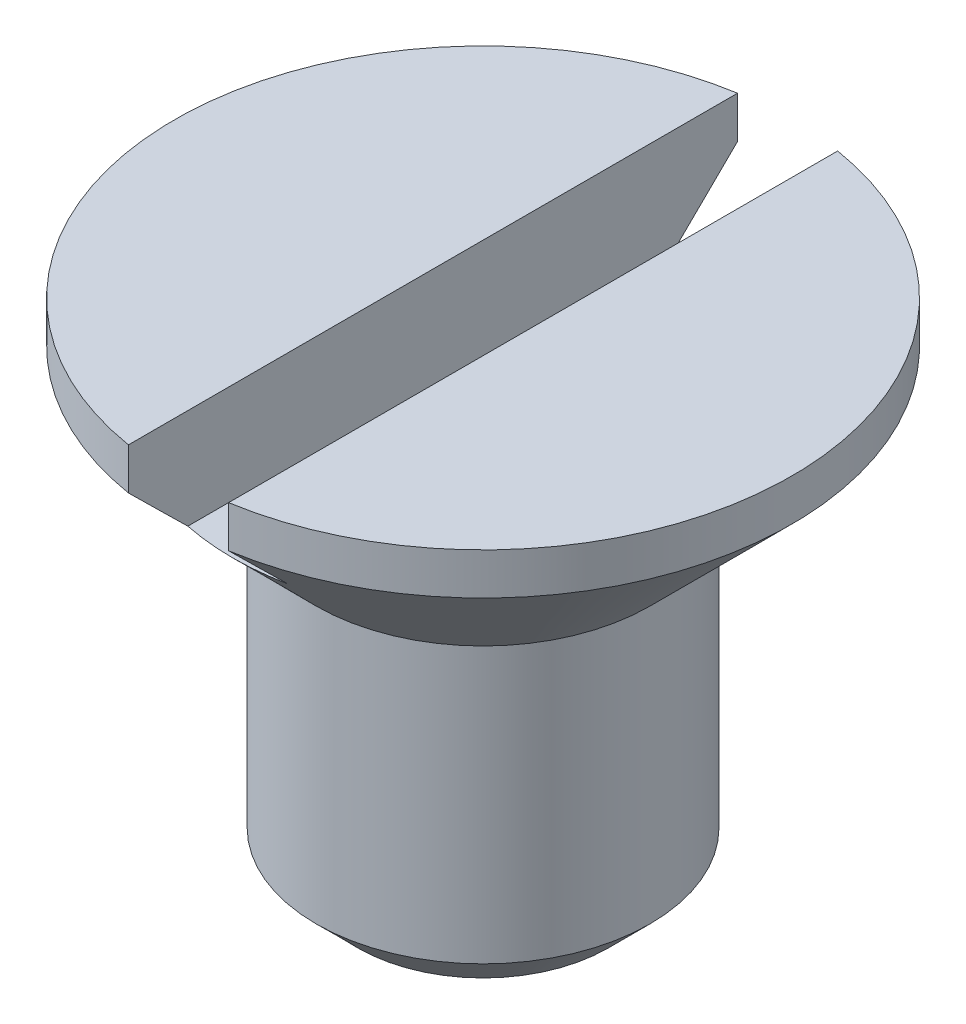
ISO-10303-21;
HEADER;
FILE_DESCRIPTION(('STEP AP214'),'2;1');
FILE_NAME('part.step','',(''),(''),'','','');
FILE_SCHEMA(('AUTOMOTIVE_DESIGN { 1 0 10303 214 1 1 1 1 }'));
ENDSEC;
DATA;
#1=APPLICATION_CONTEXT('core data for automotive mechanical design processes');
#2=APPLICATION_PROTOCOL_DEFINITION('international standard','automotive_design',2000,#1);
#3=PRODUCT_CONTEXT('',#1,'mechanical');
#4=PRODUCT('Part','Part','',(#3));
#5=PRODUCT_RELATED_PRODUCT_CATEGORY('part','',(#4));
#6=PRODUCT_DEFINITION_FORMATION('','',#4);
#7=PRODUCT_DEFINITION_CONTEXT('part definition',#1,'design');
#8=PRODUCT_DEFINITION('design','',#6,#7);
#9=PRODUCT_DEFINITION_SHAPE('','',#8);
#10=(LENGTH_UNIT() NAMED_UNIT(*) SI_UNIT(.MILLI.,.METRE.));
#11=(NAMED_UNIT(*) PLANE_ANGLE_UNIT() SI_UNIT($,.RADIAN.));
#12=(NAMED_UNIT(*) SI_UNIT($,.STERADIAN.) SOLID_ANGLE_UNIT());
#13=UNCERTAINTY_MEASURE_WITH_UNIT(LENGTH_MEASURE(1.E-05),#10,'distance_accuracy_value','');
#14=(GEOMETRIC_REPRESENTATION_CONTEXT(3) GLOBAL_UNCERTAINTY_ASSIGNED_CONTEXT((#13)) GLOBAL_UNIT_ASSIGNED_CONTEXT((#10,
#11,#12)) REPRESENTATION_CONTEXT('',''));
#15=CARTESIAN_POINT('',(0.,0.,0.));
#16=DIRECTION('',(0.,0.,1.));
#17=DIRECTION('',(1.,0.,0.));
#18=AXIS2_PLACEMENT_3D('',#15,#16,#17);
#19=CARTESIAN_POINT('',(-3.7,6.,0.));
#20=DIRECTION('',(0.,1.,0.));
#21=DIRECTION('',(-1.,0.,0.));
#22=AXIS2_PLACEMENT_3D('',#19,#20,#21);
#23=PLANE('',#22);
#24=DIRECTION('',(0.,0.,1.));
#25=VECTOR('',#24,1.);
#26=CARTESIAN_POINT('',(-0.6,6.,-3.7));
#27=LINE('',#26,#25);
#28=CARTESIAN_POINT('',(-0.6,6.,-3.65102725270574));
#29=VERTEX_POINT('',#28);
#30=CARTESIAN_POINT('',(-0.6,6.,3.65102725270574));
#31=VERTEX_POINT('',#30);
#32=EDGE_CURVE('E136',#29,#31,#27,.T.);
#33=ORIENTED_EDGE('',*,*,#32,.F.);
#34=CARTESIAN_POINT('',(0.,6.,0.));
#35=DIRECTION('',(0.,1.,0.));
#36=DIRECTION('',(-1.,0.,0.));
#37=AXIS2_PLACEMENT_3D('',#34,#35,#36);
#38=CIRCLE('',#37,3.7);
#39=EDGE_CURVE('E113',#29,#31,#38,.T.);
#40=ORIENTED_EDGE('',*,*,#39,.T.);
#41=EDGE_LOOP('',(#33,#40));
#42=FACE_BOUND('',#41,.T.);
#43=ADVANCED_FACE('F29',(#42),#23,.T.);
#44=CARTESIAN_POINT('',(0.,6.,0.));
#45=DIRECTION('',(0.,1.,0.));
#46=DIRECTION('',(-1.,0.,0.));
#47=AXIS2_PLACEMENT_3D('',#44,#45,#46);
#48=CYLINDRICAL_SURFACE('',#47,3.7);
#49=DIRECTION('',(0.,1.,0.));
#50=VECTOR('',#49,1.);
#51=CARTESIAN_POINT('',(-0.6,6.,3.65102725270574));
#52=LINE('',#51,#50);
#53=CARTESIAN_POINT('',(-0.6,5.50000000000002,3.65102725270574));
#54=VERTEX_POINT('',#53);
#55=EDGE_CURVE('E57',#31,#54,#52,.F.);
#56=ORIENTED_EDGE('',*,*,#55,.F.);
#57=ORIENTED_EDGE('',*,*,#39,.F.);
#58=DIRECTION('',(0.,1.,0.));
#59=VECTOR('',#58,1.);
#60=CARTESIAN_POINT('',(-0.6,6.,-3.65102725270574));
#61=LINE('',#60,#59);
#62=CARTESIAN_POINT('',(-0.6,5.50000000000002,-3.65102725270574));
#63=VERTEX_POINT('',#62);
#64=EDGE_CURVE('E130',#63,#29,#61,.T.);
#65=ORIENTED_EDGE('',*,*,#64,.F.);
#66=CARTESIAN_POINT('',(0.,5.50000000000002,0.));
#67=DIRECTION('',(0.,1.,0.));
#68=DIRECTION('',(-1.,0.,0.));
#69=AXIS2_PLACEMENT_3D('',#66,#67,#68);
#70=CIRCLE('',#69,3.7);
#71=EDGE_CURVE('E117',#63,#54,#70,.T.);
#72=ORIENTED_EDGE('',*,*,#71,.T.);
#73=EDGE_LOOP('',(#56,#57,#65,#72));
#74=FACE_BOUND('',#73,.T.);
#75=ADVANCED_FACE('F146',(#74),#48,.T.);
#76=DIRECTION('',(0.,0.,1.));
#77=VECTOR('',#76,1.);
#78=CARTESIAN_POINT('',(0.6,6.,-3.7));
#79=LINE('',#78,#77);
#80=CARTESIAN_POINT('',(0.6,6.,-3.65102725270574));
#81=VERTEX_POINT('',#80);
#82=CARTESIAN_POINT('',(0.6,6.,3.65102725270574));
#83=VERTEX_POINT('',#82);
#84=EDGE_CURVE('E100',#81,#83,#79,.T.);
#85=ORIENTED_EDGE('',*,*,#84,.T.);
#86=EDGE_CURVE('E111',#83,#81,#38,.T.);
#87=ORIENTED_EDGE('',*,*,#86,.T.);
#88=EDGE_LOOP('',(#85,#87));
#89=FACE_BOUND('',#88,.T.);
#90=ADVANCED_FACE('F31',(#89),#23,.T.);
#91=DIRECTION('',(0.,1.,0.));
#92=VECTOR('',#91,1.);
#93=CARTESIAN_POINT('',(0.6,6.,-3.65102725270574));
#94=LINE('',#93,#92);
#95=CARTESIAN_POINT('',(0.6,5.50000000000002,-3.65102725270574));
#96=VERTEX_POINT('',#95);
#97=EDGE_CURVE('E132',#81,#96,#94,.F.);
#98=ORIENTED_EDGE('',*,*,#97,.F.);
#99=ORIENTED_EDGE('',*,*,#86,.F.);
#100=DIRECTION('',(0.,1.,0.));
#101=VECTOR('',#100,1.);
#102=CARTESIAN_POINT('',(0.6,6.,3.65102725270574));
#103=LINE('',#102,#101);
#104=CARTESIAN_POINT('',(0.6,5.50000000000002,3.65102725270574));
#105=VERTEX_POINT('',#104);
#106=EDGE_CURVE('E134',#105,#83,#103,.T.);
#107=ORIENTED_EDGE('',*,*,#106,.F.);
#108=EDGE_CURVE('E106',#105,#96,#70,.T.);
#109=ORIENTED_EDGE('',*,*,#108,.T.);
#110=EDGE_LOOP('',(#98,#99,#107,#109));
#111=FACE_BOUND('',#110,.T.);
#112=ADVANCED_FACE('F153',(#111),#48,.T.);
#113=CARTESIAN_POINT('',(0.,5.50000000000002,0.));
#114=DIRECTION('',(0.,1.,0.));
#115=DIRECTION('',(-1.,0.,0.));
#116=AXIS2_PLACEMENT_3D('',#113,#114,#115);
#117=CONICAL_SURFACE('',#116,3.7,0.785398163397443);
#118=CARTESIAN_POINT('',(-0.600000000000001,9.96002062419557,8.13793196010486));
#119=CARTESIAN_POINT('',(-0.600000000000001,9.67689128128451,7.85402777231897));
#120=CARTESIAN_POINT('',(-0.600000000000001,9.39379608619092,7.57008950002177));
#121=CARTESIAN_POINT('',(-0.600000000000001,8.82770997014745,7.00209082271698));
#122=CARTESIAN_POINT('',(-0.600000000000001,8.54471905284609,6.71803041407336));
#123=CARTESIAN_POINT('',(-0.6,7.97868260725446,6.14953775036886));
#124=CARTESIAN_POINT('',(-0.6,7.69563719837716,5.86510537638401));
#125=CARTESIAN_POINT('',(-0.6,7.12979934399216,5.29600682483286));
#126=CARTESIAN_POINT('',(-0.6,6.84700689083492,5.01134065487301));
#127=CARTESIAN_POINT('',(-0.6,6.28573332583054,4.44556875001047));
#128=CARTESIAN_POINT('',(-0.6,6.00724680806451,4.16446838236597));
#129=CARTESIAN_POINT('',(-0.6,5.59002402076898,3.74228982182657));
#130=CARTESIAN_POINT('',(-0.6,5.45102756858926,3.60146883259403));
#131=CARTESIAN_POINT('',(-0.6,5.17328458074779,3.31958319518965));
#132=CARTESIAN_POINT('',(-0.6,5.0345380427178,3.17851854935183));
#133=CARTESIAN_POINT('',(-0.6,4.7574716483417,2.89609946410978));
#134=CARTESIAN_POINT('',(-0.6,4.6191516232573,2.75474519043096));
#135=CARTESIAN_POINT('',(-0.6,4.34307152650493,2.47148070482769));
#136=CARTESIAN_POINT('',(-0.6,4.20531147549013,2.32957047277055));
#137=CARTESIAN_POINT('',(-0.6,3.93074167412053,2.04487556787213));
#138=CARTESIAN_POINT('',(-0.6,3.79393176803235,1.90209104591261));
#139=CARTESIAN_POINT('',(-0.6,3.59005283805898,1.68665676476746));
#140=CARTESIAN_POINT('',(-0.6,3.52231783944741,1.61463791010643));
#141=CARTESIAN_POINT('',(-0.6,3.38750438125967,1.4699889932015));
#142=CARTESIAN_POINT('',(-0.599999999999999,3.3204259074044,1.39735894431496));
#143=CARTESIAN_POINT('',(-0.599999999999999,3.21737067452687,1.28421539613836));
#144=CARTESIAN_POINT('',(-0.599999999999999,3.18104052020517,1.2440240295227));
#145=CARTESIAN_POINT('',(-0.599999999999999,3.10877701321241,1.16328117926467));
#146=CARTESIAN_POINT('',(-0.599999999999999,3.07284368408855,1.12272967450692));
#147=CARTESIAN_POINT('',(-0.599999999999999,3.0013920679676,1.04102691374381));
#148=CARTESIAN_POINT('',(-0.599999999999999,2.96587552547039,0.999874128580939));
#149=CARTESIAN_POINT('',(-0.599999999999999,2.89558487643354,0.916946976871492));
#150=CARTESIAN_POINT('',(-0.599999999999999,2.86081066138162,0.875172702709307));
#151=CARTESIAN_POINT('',(-0.599999999999999,2.79510737046944,0.794199307952507));
#152=CARTESIAN_POINT('',(-0.599999999999999,2.76409575648193,0.755067466057446));
#153=CARTESIAN_POINT('',(-0.599999999999999,2.70336797523996,0.675813657835006));
#154=CARTESIAN_POINT('',(-0.599999999999999,2.67365157281672,0.635691873338646));
#155=CARTESIAN_POINT('',(-0.599999999999999,2.61622665647741,0.554135181970048));
#156=CARTESIAN_POINT('',(-0.599999999999999,2.58851442849082,0.512702919788465));
#157=CARTESIAN_POINT('',(-0.599999999999999,2.53621522205618,0.427935425074668));
#158=CARTESIAN_POINT('',(-0.599999999999999,2.51162392023787,0.384602939456317));
#159=CARTESIAN_POINT('',(-0.599999999999999,2.47077124344621,0.301726491885899));
#160=CARTESIAN_POINT('',(-0.599999999999999,2.45382070718996,0.262532602955205));
#161=CARTESIAN_POINT('',(-0.599999999999999,2.42590828603838,0.18210931201581));
#162=CARTESIAN_POINT('',(-0.599999999999999,2.41492295078954,0.140888585704837));
#163=CARTESIAN_POINT('',(-0.599999999999999,2.402410068702,0.0639247858075754));
#164=CARTESIAN_POINT('',(-0.599999999999999,2.39962349148702,0.0283967599025259));
#165=CARTESIAN_POINT('',(-0.599999999999999,2.40046012470945,-0.0425631065150499));
#166=CARTESIAN_POINT('',(-0.599999999999999,2.40408119868653,-0.0779949751437847));
#167=CARTESIAN_POINT('',(-0.599999999999999,2.4191108613007,-0.159349986954467));
#168=CARTESIAN_POINT('',(-0.599999999999999,2.43270391393231,-0.204855293705316));
#169=CARTESIAN_POINT('',(-0.599999999999999,2.4581067891676,-0.271162915462737));
#170=CARTESIAN_POINT('',(-0.599999999999999,2.46744883758507,-0.293008638455446));
#171=CARTESIAN_POINT('',(-0.599999999999999,2.48745397120612,-0.336087239478989));
#172=CARTESIAN_POINT('',(-0.599999999999999,2.49811672299073,-0.357320270525167));
#173=CARTESIAN_POINT('',(-0.599999999999999,2.52939555581038,-0.415982831640744));
#174=CARTESIAN_POINT('',(-0.599999999999999,2.55115624380447,-0.452795694277321));
#175=CARTESIAN_POINT('',(-0.599999999999999,2.59682208128607,-0.52507796498419));
#176=CARTESIAN_POINT('',(-0.599999999999999,2.62072901479265,-0.560546219893633));
#177=CARTESIAN_POINT('',(-0.599999999999999,2.67004195715455,-0.630548437000623));
#178=CARTESIAN_POINT('',(-0.599999999999999,2.69545152537907,-0.665079873092611));
#179=CARTESIAN_POINT('',(-0.599999999999999,2.74728510442057,-0.733375806005284));
#180=CARTESIAN_POINT('',(-0.599999999999999,2.77370928127677,-0.767140175845293));
#181=CARTESIAN_POINT('',(-0.599999999999999,2.85434134965784,-0.867919244140601));
#182=CARTESIAN_POINT('',(-0.599999999999999,2.90964257975872,-0.934056109051688));
#183=CARTESIAN_POINT('',(-0.599999999999999,3.02176654130163,-1.06481071116445));
#184=CARTESIAN_POINT('',(-0.599999999999999,3.07858650349832,-1.12943085704489));
#185=CARTESIAN_POINT('',(-0.599999999999999,3.192411871062,-1.25682824367007));
#186=CARTESIAN_POINT('',(-0.6,3.24940259970986,-1.31961861941938));
#187=CARTESIAN_POINT('',(-0.6,3.36404478846879,-1.44459287058124));
#188=CARTESIAN_POINT('',(-0.6,3.42169625897606,-1.5067767364223));
#189=CARTESIAN_POINT('',(-0.6,3.59534223900288,-1.69270278432736));
#190=CARTESIAN_POINT('',(-0.6,3.71201793375948,-1.81580796723871));
#191=CARTESIAN_POINT('',(-0.6,3.9464428075933,-2.06118874847644));
#192=CARTESIAN_POINT('',(-0.6,4.06419282008441,-2.18346354647027));
#193=CARTESIAN_POINT('',(-0.6,4.30028890308817,-2.42742423040912));
#194=CARTESIAN_POINT('',(-0.6,4.41863494334996,-2.54911014563974));
#195=CARTESIAN_POINT('',(-0.6,4.65500717812542,-2.79137280615532));
#196=CARTESIAN_POINT('',(-0.6,4.77303104136329,-2.91195182898467));
#197=CARTESIAN_POINT('',(-0.6,5.00934781550327,-3.15284893689332));
#198=CARTESIAN_POINT('',(-0.6,5.12764072989205,-3.2731670185511));
#199=CARTESIAN_POINT('',(-0.6,5.48272713697438,-3.63376526150939));
#200=CARTESIAN_POINT('',(-0.6,5.71980374699246,-3.87376652863284));
#201=CARTESIAN_POINT('',(-0.6,6.28863195924062,-4.44861133790154));
#202=CARTESIAN_POINT('',(-0.6,6.62058203399434,-4.78325830289937));
#203=CARTESIAN_POINT('',(-0.6,7.28494781383586,-5.45216769917103));
#204=CARTESIAN_POINT('',(-0.6,7.61736356911089,-5.78643008057183));
#205=CARTESIAN_POINT('',(-0.6,8.28474579300058,-6.45701285565824));
#206=CARTESIAN_POINT('',(-0.6,8.61971401228284,-6.79333150662997));
#207=CARTESIAN_POINT('',(-0.600000000000001,9.28978081055595,-7.46575829971186));
#208=CARTESIAN_POINT('',(-0.600000000000001,9.62487936901474,-7.80186646228029));
#209=CARTESIAN_POINT('',(-0.600000000000001,9.96002062419557,-8.13793196010486));
#210=B_SPLINE_CURVE_WITH_KNOTS('',3,(#118,#119,#120,#121,#122,#123,#124,#125,#126,#127,#128,
#129,#130,#131,#132,#133,#134,#135,#136,#137,#138,#139,#140,#141,#142,#143,#144,#145,#146,#147,
#148,#149,#150,#151,#152,#153,#154,#155,#156,#157,#158,#159,#160,#161,#162,#163,#164,#165,#166,
#167,#168,#169,#170,#171,#172,#173,#174,#175,#176,#177,#178,#179,#180,#181,#182,#183,#184,#185,
#186,#187,#188,#189,#190,#191,#192,#193,#194,#195,#196,#197,#198,#199,#200,#201,#202,#203,#204,
#205,#206,#207,#208,#209),.UNSPECIFIED.,.F.,.F.,(4,2,2,2,2,2,2,2,2,2,2,2,2,2,2,2,2,2,2,2,2,2,2,
2,2,2,2,2,2,2,2,2,2,2,2,2,2,2,2,2,2,2,2,2,2,4),(0.,1.20286091475452,2.40576053584867,
3.6095661884296,4.81333411531858,6.00040930817249,6.59400413473686,7.18759330634946,
7.78090579697013,8.3742399753186,8.96747449255334,9.26407415171825,9.56066734558071,
9.72319861560583,9.8857394788069,10.0488126207255,10.2118617593269,10.3616347814149,
10.5113804952798,10.6608411897886,10.8100925247216,10.9379019301194,11.0652051861339,
11.1715563779878,11.2778721165554,11.4194479223042,11.490703624151,11.5619413736212,
11.6901080531411,11.8183822726337,11.9469735623142,12.075585986218,12.3341618029343,
12.5922945826552,12.8466786122314,13.1010666498339,13.6098890890933,14.1191470825748,
14.6283794844878,15.1345611743107,15.6407494616196,16.6528023877672,18.066879145093,
19.4811222704146,20.9051395740234,22.3289855542461),.UNSPECIFIED.);
#211=CARTESIAN_POINT('',(-0.6,4.8,2.9393876913398));
#212=VERTEX_POINT('',#211);
#213=EDGE_CURVE('E11',#54,#212,#210,.T.);
#214=ORIENTED_EDGE('',*,*,#213,.F.);
#215=ORIENTED_EDGE('',*,*,#71,.F.);
#216=CARTESIAN_POINT('',(-0.6,4.8,-2.9393876913398));
#217=VERTEX_POINT('',#216);
#218=EDGE_CURVE('E33',#217,#63,#210,.T.);
#219=ORIENTED_EDGE('',*,*,#218,.F.);
#220=CARTESIAN_POINT('',(0.,4.8,0.));
#221=DIRECTION('',(0.,-1.,0.));
#222=DIRECTION('',(0.,0.,-1.));
#223=AXIS2_PLACEMENT_3D('',#220,#221,#222);
#224=CIRCLE('',#223,2.99999999999999);
#225=CARTESIAN_POINT('',(0.6,4.8,-2.9393876913398));
#226=VERTEX_POINT('',#225);
#227=EDGE_CURVE('E93',#226,#217,#224,.F.);
#228=ORIENTED_EDGE('',*,*,#227,.F.);
#229=CARTESIAN_POINT('',(0.600000000000001,9.96002062419557,-8.13793196010486));
#230=CARTESIAN_POINT('',(0.600000000000001,9.67689128128451,-7.85402777231897));
#231=CARTESIAN_POINT('',(0.600000000000001,9.39379608619092,-7.57008950002176));
#232=CARTESIAN_POINT('',(0.600000000000001,8.82770997014745,-7.00209082271698));
#233=CARTESIAN_POINT('',(0.600000000000001,8.54471905284609,-6.71803041407335));
#234=CARTESIAN_POINT('',(0.6,7.97868260725446,-6.14953775036886));
#235=CARTESIAN_POINT('',(0.6,7.69563719837715,-5.865105376384));
#236=CARTESIAN_POINT('',(0.6,7.12979934399215,-5.29600682483285));
#237=CARTESIAN_POINT('',(0.6,6.84700689083491,-5.011340654873));
#238=CARTESIAN_POINT('',(0.6,6.28573332583054,-4.44556875001047));
#239=CARTESIAN_POINT('',(0.6,6.0072468080645,-4.16446838236596));
#240=CARTESIAN_POINT('',(0.6,5.59002402076897,-3.74228982182656));
#241=CARTESIAN_POINT('',(0.6,5.45102756858925,-3.60146883259402));
#242=CARTESIAN_POINT('',(0.6,5.17328458074778,-3.31958319518964));
#243=CARTESIAN_POINT('',(0.6,5.03453804271779,-3.17851854935183));
#244=CARTESIAN_POINT('',(0.6,4.7574716483417,-2.89609946410978));
#245=CARTESIAN_POINT('',(0.6,4.61915162325729,-2.75474519043095));
#246=CARTESIAN_POINT('',(0.6,4.34307152650493,-2.47148070482768));
#247=CARTESIAN_POINT('',(0.6,4.20531147549012,-2.32957047277055));
#248=CARTESIAN_POINT('',(0.6,3.93074167412052,-2.04487556787213));
#249=CARTESIAN_POINT('',(0.6,3.79393176803235,-1.9020910459126));
#250=CARTESIAN_POINT('',(0.6,3.59005283805898,-1.68665676476745));
#251=CARTESIAN_POINT('',(0.6,3.52231783944741,-1.61463791010643));
#252=CARTESIAN_POINT('',(0.6,3.38750438125967,-1.4699889932015));
#253=CARTESIAN_POINT('',(0.599999999999999,3.3204259074044,-1.39735894431495));
#254=CARTESIAN_POINT('',(0.599999999999999,3.21737067452687,-1.28421539613836));
#255=CARTESIAN_POINT('',(0.599999999999999,3.18104052020517,-1.2440240295227));
#256=CARTESIAN_POINT('',(0.599999999999999,3.1087770132124,-1.16328117926467));
#257=CARTESIAN_POINT('',(0.599999999999999,3.07284368408855,-1.12272967450692));
#258=CARTESIAN_POINT('',(0.599999999999999,3.0013920679676,-1.04102691374381));
#259=CARTESIAN_POINT('',(0.599999999999999,2.96587552547039,-0.999874128580938));
#260=CARTESIAN_POINT('',(0.599999999999999,2.89558487643354,-0.916946976871492));
#261=CARTESIAN_POINT('',(0.599999999999999,2.86081066138162,-0.875172702709306));
#262=CARTESIAN_POINT('',(0.599999999999999,2.79510737046943,-0.794199307952506));
#263=CARTESIAN_POINT('',(0.599999999999999,2.76409575648193,-0.755067466057446));
#264=CARTESIAN_POINT('',(0.599999999999999,2.70336797523996,-0.675813657835006));
#265=CARTESIAN_POINT('',(0.599999999999999,2.67365157281672,-0.635691873338646));
#266=CARTESIAN_POINT('',(0.599999999999999,2.61622665647741,-0.554135181970049));
#267=CARTESIAN_POINT('',(0.599999999999999,2.58851442849082,-0.512702919788465));
#268=CARTESIAN_POINT('',(0.599999999999999,2.53621522205618,-0.427935425074668));
#269=CARTESIAN_POINT('',(0.599999999999999,2.51162392023787,-0.384602939456317));
#270=CARTESIAN_POINT('',(0.599999999999999,2.47077124344621,-0.301726491885898));
#271=CARTESIAN_POINT('',(0.599999999999999,2.45382070718996,-0.262532602955204));
#272=CARTESIAN_POINT('',(0.599999999999999,2.42590828603837,-0.182109312015809));
#273=CARTESIAN_POINT('',(0.599999999999999,2.41492295078954,-0.140888585704837));
#274=CARTESIAN_POINT('',(0.599999999999999,2.402410068702,-0.063924785807575));
#275=CARTESIAN_POINT('',(0.599999999999999,2.39962349148702,-0.0283967599025254));
#276=CARTESIAN_POINT('',(0.599999999999999,2.40046012470945,0.0425631065150503));
#277=CARTESIAN_POINT('',(0.599999999999999,2.40408119868653,0.0779949751437851));
#278=CARTESIAN_POINT('',(0.599999999999999,2.4191108613007,0.159349986954468));
#279=CARTESIAN_POINT('',(0.599999999999999,2.43270391393231,0.204855293705317));
#280=CARTESIAN_POINT('',(0.599999999999999,2.4581067891676,0.271162915462737));
#281=CARTESIAN_POINT('',(0.599999999999999,2.46744883758507,0.293008638455446));
#282=CARTESIAN_POINT('',(0.599999999999999,2.48745397120612,0.336087239478989));
#283=CARTESIAN_POINT('',(0.599999999999999,2.49811672299073,0.357320270525168));
#284=CARTESIAN_POINT('',(0.599999999999999,2.52939555581038,0.415982831640744));
#285=CARTESIAN_POINT('',(0.599999999999999,2.55115624380447,0.452795694277321));
#286=CARTESIAN_POINT('',(0.599999999999999,2.59682208128607,0.52507796498419));
#287=CARTESIAN_POINT('',(0.599999999999999,2.62072901479265,0.560546219893634));
#288=CARTESIAN_POINT('',(0.599999999999999,2.67004195715455,0.630548437000625));
#289=CARTESIAN_POINT('',(0.599999999999999,2.69545152537908,0.665079873092613));
#290=CARTESIAN_POINT('',(0.599999999999999,2.74728510442057,0.733375806005286));
#291=CARTESIAN_POINT('',(0.599999999999999,2.77370928127677,0.767140175845295));
#292=CARTESIAN_POINT('',(0.599999999999999,2.85434134965784,0.867919244140603));
#293=CARTESIAN_POINT('',(0.599999999999999,2.90964257975872,0.93405610905169));
#294=CARTESIAN_POINT('',(0.599999999999999,3.02176654130163,1.06481071116445));
#295=CARTESIAN_POINT('',(0.599999999999999,3.07858650349832,1.1294308570449));
#296=CARTESIAN_POINT('',(0.599999999999999,3.192411871062,1.25682824367007));
#297=CARTESIAN_POINT('',(0.6,3.24940259970986,1.31961861941938));
#298=CARTESIAN_POINT('',(0.6,3.36404478846879,1.44459287058124));
#299=CARTESIAN_POINT('',(0.6,3.42169625897606,1.50677673642231));
#300=CARTESIAN_POINT('',(0.6,3.59534223900288,1.69270278432736));
#301=CARTESIAN_POINT('',(0.6,3.71201793375949,1.81580796723872));
#302=CARTESIAN_POINT('',(0.6,3.94644280759331,2.06118874847644));
#303=CARTESIAN_POINT('',(0.6,4.06419282008442,2.18346354647028));
#304=CARTESIAN_POINT('',(0.6,4.30028890308818,2.42742423040912));
#305=CARTESIAN_POINT('',(0.6,4.41863494334996,2.54911014563974));
#306=CARTESIAN_POINT('',(0.6,4.65500717812542,2.79137280615532));
#307=CARTESIAN_POINT('',(0.6,4.7730310413633,2.91195182898468));
#308=CARTESIAN_POINT('',(0.6,5.00934781550328,3.15284893689333));
#309=CARTESIAN_POINT('',(0.6,5.12764072989206,3.27316701855111));
#310=CARTESIAN_POINT('',(0.6,5.48272713697439,3.63376526150941));
#311=CARTESIAN_POINT('',(0.6,5.71980374699247,3.87376652863285));
#312=CARTESIAN_POINT('',(0.6,6.28863195924062,4.44861133790155));
#313=CARTESIAN_POINT('',(0.6,6.62058203399435,4.78325830289938));
#314=CARTESIAN_POINT('',(0.6,7.28494781383587,5.45216769917104));
#315=CARTESIAN_POINT('',(0.6,7.61736356911089,5.78643008057184));
#316=CARTESIAN_POINT('',(0.6,8.28474579300059,6.45701285565824));
#317=CARTESIAN_POINT('',(0.6,8.61971401228285,6.79333150662997));
#318=CARTESIAN_POINT('',(0.600000000000001,9.28978081055595,7.46575829971186));
#319=CARTESIAN_POINT('',(0.600000000000001,9.62487936901474,7.80186646228029));
#320=CARTESIAN_POINT('',(0.600000000000001,9.96002062419557,8.13793196010486));
#321=B_SPLINE_CURVE_WITH_KNOTS('',3,(#229,#230,#231,#232,#233,#234,#235,#236,#237,#238,#239,
#240,#241,#242,#243,#244,#245,#246,#247,#248,#249,#250,#251,#252,#253,#254,#255,#256,#257,#258,
#259,#260,#261,#262,#263,#264,#265,#266,#267,#268,#269,#270,#271,#272,#273,#274,#275,#276,#277,
#278,#279,#280,#281,#282,#283,#284,#285,#286,#287,#288,#289,#290,#291,#292,#293,#294,#295,#296,
#297,#298,#299,#300,#301,#302,#303,#304,#305,#306,#307,#308,#309,#310,#311,#312,#313,#314,#315,
#316,#317,#318,#319,#320),.UNSPECIFIED.,.F.,.F.,(4,2,2,2,2,2,2,2,2,2,2,2,2,2,2,2,2,2,2,2,2,2,2,
2,2,2,2,2,2,2,2,2,2,2,2,2,2,2,2,2,2,2,2,2,2,4),(0.,1.20286091475452,2.40576053584868,
3.60956618842961,4.81333411531859,6.0004093081725,6.59400413473687,7.18759330634947,
7.78090579697013,8.37423997531861,8.96747449255334,9.26407415171825,9.56066734558071,
9.72319861560583,9.8857394788069,10.0488126207255,10.2118617593269,10.3616347814149,
10.5113804952798,10.6608411897885,10.8100925247216,10.9379019301194,11.0652051861339,
11.1715563779878,11.2778721165554,11.4194479223042,11.490703624151,11.5619413736212,
11.6901080531411,11.8183822726337,11.9469735623142,12.075585986218,12.3341618029343,
12.5922945826552,12.8466786122314,13.1010666498339,13.6098890890933,14.1191470825748,
14.6283794844878,15.1345611743108,15.6407494616196,16.6528023877673,18.066879145093,
19.4811222704146,20.9051395740234,22.3289855542461),.UNSPECIFIED.);
#322=EDGE_CURVE('E98',#96,#226,#321,.T.);
#323=ORIENTED_EDGE('',*,*,#322,.F.);
#324=ORIENTED_EDGE('',*,*,#108,.F.);
#325=CARTESIAN_POINT('',(0.6,4.8,2.9393876913398));
#326=VERTEX_POINT('',#325);
#327=EDGE_CURVE('E43',#326,#105,#321,.T.);
#328=ORIENTED_EDGE('',*,*,#327,.F.);
#329=EDGE_CURVE('E86',#212,#326,#224,.F.);
#330=ORIENTED_EDGE('',*,*,#329,.F.);
#331=EDGE_LOOP('',(#214,#215,#219,#228,#323,#324,#328,#330));
#332=FACE_BOUND('',#331,.T.);
#333=CARTESIAN_POINT('',(0.,3.8,0.));
#334=DIRECTION('',(0.,1.,0.));
#335=DIRECTION('',(-1.,0.,0.));
#336=AXIS2_PLACEMENT_3D('',#333,#334,#335);
#337=CIRCLE('',#336,2.);
#338=CARTESIAN_POINT('',(-2.,3.8,0.));
#339=VERTEX_POINT('',#338);
#340=EDGE_CURVE('E120',#339,#339,#337,.T.);
#341=ORIENTED_EDGE('',*,*,#340,.T.);
#342=EDGE_LOOP('',(#341));
#343=FACE_BOUND('',#342,.T.);
#344=ADVANCED_FACE('F103',(#332,#343),#117,.T.);
#345=CARTESIAN_POINT('',(0.,6.,0.));
#346=DIRECTION('',(0.,1.,0.));
#347=DIRECTION('',(-1.,0.,0.));
#348=AXIS2_PLACEMENT_3D('',#345,#346,#347);
#349=CYLINDRICAL_SURFACE('',#348,2.);
#350=CARTESIAN_POINT('',(0.,0.499999999999997,0.));
#351=DIRECTION('',(0.,1.,0.));
#352=DIRECTION('',(-1.,0.,0.));
#353=AXIS2_PLACEMENT_3D('',#350,#351,#352);
#354=CIRCLE('',#353,2.);
#355=CARTESIAN_POINT('',(-2.,0.499999999999997,0.));
#356=VERTEX_POINT('',#355);
#357=EDGE_CURVE('E123',#356,#356,#354,.T.);
#358=ORIENTED_EDGE('',*,*,#357,.T.);
#359=EDGE_LOOP('',(#358));
#360=FACE_BOUND('',#359,.T.);
#361=ORIENTED_EDGE('',*,*,#340,.F.);
#362=EDGE_LOOP('',(#361));
#363=FACE_BOUND('',#362,.T.);
#364=ADVANCED_FACE('F166',(#360,#363),#349,.T.);
#365=CARTESIAN_POINT('',(0.,0.499999999999997,0.));
#366=DIRECTION('',(0.,1.,0.));
#367=DIRECTION('',(-1.,0.,0.));
#368=AXIS2_PLACEMENT_3D('',#365,#366,#367);
#369=CONICAL_SURFACE('',#368,2.,0.78539816339745);
#370=CARTESIAN_POINT('',(0.,0.,0.));
#371=DIRECTION('',(0.,1.,0.));
#372=DIRECTION('',(-1.,0.,0.));
#373=AXIS2_PLACEMENT_3D('',#370,#371,#372);
#374=CIRCLE('',#373,1.5);
#375=CARTESIAN_POINT('',(-1.5,0.,0.));
#376=VERTEX_POINT('',#375);
#377=EDGE_CURVE('E126',#376,#376,#374,.T.);
#378=ORIENTED_EDGE('',*,*,#377,.T.);
#379=EDGE_LOOP('',(#378));
#380=FACE_BOUND('',#379,.T.);
#381=ORIENTED_EDGE('',*,*,#357,.F.);
#382=EDGE_LOOP('',(#381));
#383=FACE_BOUND('',#382,.T.);
#384=ADVANCED_FACE('F172',(#380,#383),#369,.T.);
#385=CARTESIAN_POINT('',(0.,0.,0.));
#386=DIRECTION('',(0.,-1.,0.));
#387=DIRECTION('',(1.,0.,0.));
#388=AXIS2_PLACEMENT_3D('',#385,#386,#387);
#389=PLANE('',#388);
#390=ORIENTED_EDGE('',*,*,#377,.F.);
#391=EDGE_LOOP('',(#390));
#392=FACE_BOUND('',#391,.T.);
#393=ADVANCED_FACE('F176',(#392),#389,.T.);
#394=CARTESIAN_POINT('',(-0.6,6.,-3.7));
#395=DIRECTION('',(-1.,0.,0.));
#396=DIRECTION('',(0.,-1.,0.));
#397=AXIS2_PLACEMENT_3D('',#394,#395,#396);
#398=PLANE('',#397);
#399=ORIENTED_EDGE('',*,*,#55,.T.);
#400=ORIENTED_EDGE('',*,*,#213,.T.);
#401=DIRECTION('',(0.,0.,1.));
#402=VECTOR('',#401,1.);
#403=CARTESIAN_POINT('',(-0.6,4.8,-3.7));
#404=LINE('',#403,#402);
#405=EDGE_CURVE('E89',#217,#212,#404,.T.);
#406=ORIENTED_EDGE('',*,*,#405,.F.);
#407=ORIENTED_EDGE('',*,*,#218,.T.);
#408=ORIENTED_EDGE('',*,*,#64,.T.);
#409=ORIENTED_EDGE('',*,*,#32,.T.);
#410=EDGE_LOOP('',(#399,#400,#406,#407,#408,#409));
#411=FACE_BOUND('',#410,.T.);
#412=ADVANCED_FACE('F141',(#411),#398,.F.);
#413=CARTESIAN_POINT('',(0.6,6.,-3.7));
#414=DIRECTION('',(1.,0.,0.));
#415=DIRECTION('',(0.,1.,0.));
#416=AXIS2_PLACEMENT_3D('',#413,#414,#415);
#417=PLANE('',#416);
#418=ORIENTED_EDGE('',*,*,#97,.T.);
#419=ORIENTED_EDGE('',*,*,#322,.T.);
#420=DIRECTION('',(0.,0.,1.));
#421=VECTOR('',#420,1.);
#422=CARTESIAN_POINT('',(0.6,4.8,-3.7));
#423=LINE('',#422,#421);
#424=EDGE_CURVE('E50',#226,#326,#423,.T.);
#425=ORIENTED_EDGE('',*,*,#424,.T.);
#426=ORIENTED_EDGE('',*,*,#327,.T.);
#427=ORIENTED_EDGE('',*,*,#106,.T.);
#428=ORIENTED_EDGE('',*,*,#84,.F.);
#429=EDGE_LOOP('',(#418,#419,#425,#426,#427,#428));
#430=FACE_BOUND('',#429,.T.);
#431=ADVANCED_FACE('F95',(#430),#417,.F.);
#432=CARTESIAN_POINT('',(-0.6,4.8,-3.7));
#433=DIRECTION('',(0.,-1.,0.));
#434=DIRECTION('',(0.,0.,-1.));
#435=AXIS2_PLACEMENT_3D('',#432,#433,#434);
#436=PLANE('',#435);
#437=ORIENTED_EDGE('',*,*,#329,.T.);
#438=ORIENTED_EDGE('',*,*,#424,.F.);
#439=ORIENTED_EDGE('',*,*,#227,.T.);
#440=ORIENTED_EDGE('',*,*,#405,.T.);
#441=EDGE_LOOP('',(#437,#438,#439,#440));
#442=FACE_BOUND('',#441,.T.);
#443=ADVANCED_FACE('F87',(#442),#436,.F.);
#444=CLOSED_SHELL('',(#43,#75,#90,#112,#344,#364,#384,#393,#412,#431,#443));
#445=MANIFOLD_SOLID_BREP('B2',#444);
#446=ADVANCED_BREP_SHAPE_REPRESENTATION('',(#18,#445),#14);
#447=SHAPE_DEFINITION_REPRESENTATION(#9,#446);
ENDSEC;
END-ISO-10303-21;
